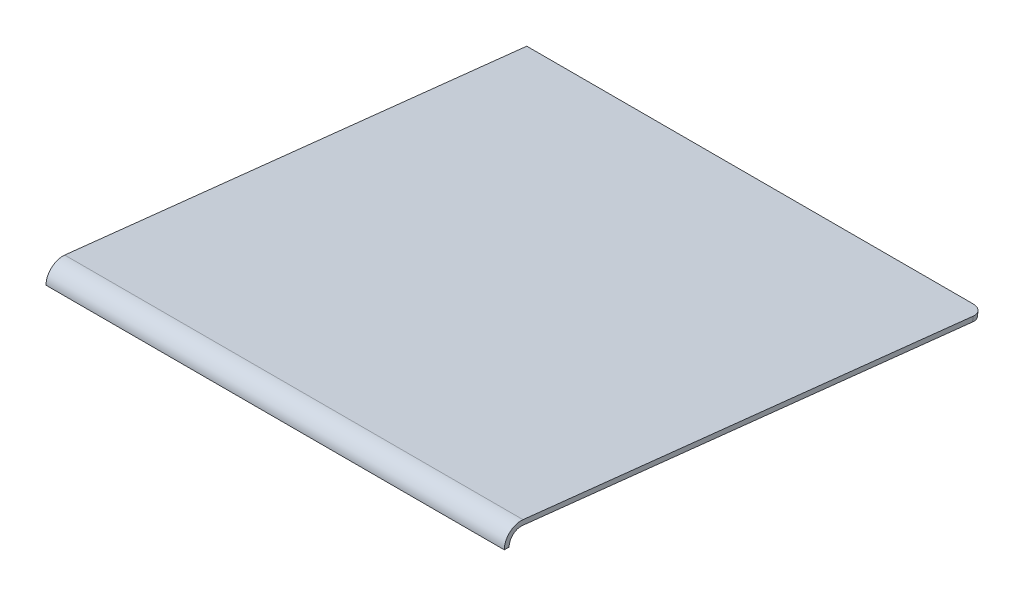
ISO-10303-21;
HEADER;
FILE_DESCRIPTION(('STEP AP214'),'2;1');
FILE_NAME('part.step','',(''),(''),'','','');
FILE_SCHEMA(('AUTOMOTIVE_DESIGN { 1 0 10303 214 1 1 1 1 }'));
ENDSEC;
DATA;
#1=APPLICATION_CONTEXT('core data for automotive mechanical design processes');
#2=APPLICATION_PROTOCOL_DEFINITION('international standard','automotive_design',2000,#1);
#3=PRODUCT_CONTEXT('',#1,'mechanical');
#4=PRODUCT('Part','Part','',(#3));
#5=PRODUCT_RELATED_PRODUCT_CATEGORY('part','',(#4));
#6=PRODUCT_DEFINITION_FORMATION('','',#4);
#7=PRODUCT_DEFINITION_CONTEXT('part definition',#1,'design');
#8=PRODUCT_DEFINITION('design','',#6,#7);
#9=PRODUCT_DEFINITION_SHAPE('','',#8);
#10=(LENGTH_UNIT() NAMED_UNIT(*) SI_UNIT(.MILLI.,.METRE.));
#11=(NAMED_UNIT(*) PLANE_ANGLE_UNIT() SI_UNIT($,.RADIAN.));
#12=(NAMED_UNIT(*) SI_UNIT($,.STERADIAN.) SOLID_ANGLE_UNIT());
#13=UNCERTAINTY_MEASURE_WITH_UNIT(LENGTH_MEASURE(1.E-05),#10,'distance_accuracy_value','');
#14=(GEOMETRIC_REPRESENTATION_CONTEXT(3) GLOBAL_UNCERTAINTY_ASSIGNED_CONTEXT((#13)) GLOBAL_UNIT_ASSIGNED_CONTEXT((#10,
#11,#12)) REPRESENTATION_CONTEXT('',''));
#15=CARTESIAN_POINT('',(0.,0.,0.));
#16=DIRECTION('',(0.,0.,1.));
#17=DIRECTION('',(1.,0.,0.));
#18=AXIS2_PLACEMENT_3D('',#15,#16,#17);
#19=CARTESIAN_POINT('',(362.,0.,0.));
#20=DIRECTION('',(1.,0.,0.));
#21=DIRECTION('',(0.,0.,-1.));
#22=AXIS2_PLACEMENT_3D('',#19,#20,#21);
#23=PLANE('',#22);
#24=DIRECTION('',(0.,0.,-1.));
#25=VECTOR('',#24,1.);
#26=CARTESIAN_POINT('',(362.,113.937005826671,37.4));
#27=LINE('',#26,#25);
#28=CARTESIAN_POINT('',(362.,113.937005826671,39.4));
#29=VERTEX_POINT('',#28);
#30=CARTESIAN_POINT('',(362.,113.937005826671,37.4));
#31=VERTEX_POINT('',#30);
#32=EDGE_CURVE('E207',#29,#31,#27,.T.);
#33=ORIENTED_EDGE('',*,*,#32,.T.);
#34=CARTESIAN_POINT('',(362.,113.937005826671,32.4));
#35=DIRECTION('',(1.,0.,0.));
#36=DIRECTION('',(0.,0.,-1.));
#37=AXIS2_PLACEMENT_3D('',#34,#35,#36);
#38=CIRCLE('',#37,5.00000000000001);
#39=CARTESIAN_POINT('',(362.,118.907830843486,31.8606497870554));
#40=VERTEX_POINT('',#39);
#41=EDGE_CURVE('E203',#40,#31,#38,.T.);
#42=ORIENTED_EDGE('',*,*,#41,.F.);
#43=DIRECTION('',(0.,0.107870042588919,0.994165003363056));
#44=VECTOR('',#43,1.);
#45=CARTESIAN_POINT('',(362.,100.,-142.4));
#46=LINE('',#45,#44);
#47=CARTESIAN_POINT('',(362.,98.6622549779722,-154.729088340045));
#48=VERTEX_POINT('',#47);
#49=EDGE_CURVE('E164',#48,#40,#46,.T.);
#50=ORIENTED_EDGE('',*,*,#49,.F.);
#51=DIRECTION('',(0.,-0.994165003363056,0.107870042588914));
#52=VECTOR('',#51,1.);
#53=CARTESIAN_POINT('',(362.,-15.4452148796673,-142.348067491777));
#54=LINE('',#53,#52);
#55=CARTESIAN_POINT('',(362.,100.650584984698,-154.944828425223));
#56=VERTEX_POINT('',#55);
#57=EDGE_CURVE('E159',#48,#56,#54,.F.);
#58=ORIENTED_EDGE('',*,*,#57,.T.);
#59=DIRECTION('',(0.,-0.107870042588919,-0.994165003363056));
#60=VECTOR('',#59,1.);
#61=CARTESIAN_POINT('',(362.,101.988330006726,-142.615740085178));
#62=LINE('',#61,#60);
#63=CARTESIAN_POINT('',(362.,120.896160850212,31.6449097018776));
#64=VERTEX_POINT('',#63);
#65=EDGE_CURVE('E189',#64,#56,#62,.T.);
#66=ORIENTED_EDGE('',*,*,#65,.F.);
#67=CARTESIAN_POINT('',(362.,113.937005826671,32.4));
#68=DIRECTION('',(1.,0.,0.));
#69=DIRECTION('',(0.,0.,-1.));
#70=AXIS2_PLACEMENT_3D('',#67,#68,#69);
#71=CIRCLE('',#70,7.00000000000001);
#72=EDGE_CURVE('E190',#29,#64,#71,.F.);
#73=ORIENTED_EDGE('',*,*,#72,.F.);
#74=EDGE_LOOP('',(#33,#42,#50,#58,#66,#73));
#75=FACE_BOUND('',#74,.T.);
#76=ADVANCED_FACE('F91',(#75),#23,.T.);
#77=CARTESIAN_POINT('',(853.368633251326,113.937005826671,32.4));
#78=DIRECTION('',(-1.,0.,0.));
#79=DIRECTION('',(0.,0.,1.));
#80=AXIS2_PLACEMENT_3D('',#77,#78,#79);
#81=CYLINDRICAL_SURFACE('',#80,5.00000000000001);
#82=CARTESIAN_POINT('',(172.,113.937005826671,32.4));
#83=DIRECTION('',(1.,0.,0.));
#84=DIRECTION('',(0.,0.,-1.));
#85=AXIS2_PLACEMENT_3D('',#82,#83,#84);
#86=CIRCLE('',#85,5.00000000000001);
#87=CARTESIAN_POINT('',(172.,118.907830843486,31.8606497870554));
#88=VERTEX_POINT('',#87);
#89=CARTESIAN_POINT('',(172.,113.937005826671,37.4));
#90=VERTEX_POINT('',#89);
#91=EDGE_CURVE('E126',#88,#90,#86,.T.);
#92=ORIENTED_EDGE('',*,*,#91,.F.);
#93=DIRECTION('',(-1.,0.,0.));
#94=VECTOR('',#93,1.);
#95=CARTESIAN_POINT('',(853.368633251326,118.907830843486,31.8606497870554));
#96=LINE('',#95,#94);
#97=EDGE_CURVE('E182',#40,#88,#96,.T.);
#98=ORIENTED_EDGE('',*,*,#97,.F.);
#99=ORIENTED_EDGE('',*,*,#41,.T.);
#100=DIRECTION('',(-1.,0.,0.));
#101=VECTOR('',#100,1.);
#102=CARTESIAN_POINT('',(853.368633251326,113.937005826671,37.4));
#103=LINE('',#102,#101);
#104=EDGE_CURVE('E95',#31,#90,#103,.T.);
#105=ORIENTED_EDGE('',*,*,#104,.T.);
#106=EDGE_LOOP('',(#92,#98,#99,#105));
#107=FACE_BOUND('',#106,.T.);
#108=ADVANCED_FACE('F93',(#107),#81,.F.);
#109=CARTESIAN_POINT('',(853.368633251326,113.937005826671,32.4));
#110=DIRECTION('',(-1.,0.,0.));
#111=DIRECTION('',(0.,0.,1.));
#112=AXIS2_PLACEMENT_3D('',#109,#110,#111);
#113=CYLINDRICAL_SURFACE('',#112,7.00000000000001);
#114=CARTESIAN_POINT('',(172.,113.937005826671,32.4));
#115=DIRECTION('',(1.,0.,0.));
#116=DIRECTION('',(0.,0.,-1.));
#117=AXIS2_PLACEMENT_3D('',#114,#115,#116);
#118=CIRCLE('',#117,7.00000000000001);
#119=CARTESIAN_POINT('',(172.,113.937005826671,39.4));
#120=VERTEX_POINT('',#119);
#121=CARTESIAN_POINT('',(172.,120.896160850212,31.6449097018776));
#122=VERTEX_POINT('',#121);
#123=EDGE_CURVE('E102',#120,#122,#118,.F.);
#124=ORIENTED_EDGE('',*,*,#123,.F.);
#125=DIRECTION('',(-1.,0.,0.));
#126=VECTOR('',#125,1.);
#127=CARTESIAN_POINT('',(853.368633251326,113.937005826671,39.4));
#128=LINE('',#127,#126);
#129=EDGE_CURVE('E218',#29,#120,#128,.T.);
#130=ORIENTED_EDGE('',*,*,#129,.F.);
#131=ORIENTED_EDGE('',*,*,#72,.T.);
#132=DIRECTION('',(-1.,0.,0.));
#133=VECTOR('',#132,1.);
#134=CARTESIAN_POINT('',(853.368633251326,120.896160850212,31.6449097018776));
#135=LINE('',#134,#133);
#136=EDGE_CURVE('E186',#64,#122,#135,.T.);
#137=ORIENTED_EDGE('',*,*,#136,.T.);
#138=EDGE_LOOP('',(#124,#130,#131,#137));
#139=FACE_BOUND('',#138,.T.);
#140=ADVANCED_FACE('F252',(#139),#113,.T.);
#141=CARTESIAN_POINT('',(853.368633251326,101.988330006726,-142.615740085178));
#142=DIRECTION('',(0.,0.994165003363056,-0.107870042588919));
#143=DIRECTION('',(0.,0.107870042588919,0.994165003363056));
#144=AXIS2_PLACEMENT_3D('',#141,#142,#143);
#145=PLANE('',#144);
#146=DIRECTION('',(0.,-0.107870042588919,-0.994165003363056));
#147=VECTOR('',#146,1.);
#148=CARTESIAN_POINT('',(172.,116.095799864366,-12.5967609334469));
#149=LINE('',#148,#147);
#150=CARTESIAN_POINT('',(172.,100.111234771754,-159.915653442038));
#151=VERTEX_POINT('',#150);
#152=EDGE_CURVE('E12',#122,#151,#149,.T.);
#153=ORIENTED_EDGE('',*,*,#152,.F.);
#154=ORIENTED_EDGE('',*,*,#136,.F.);
#155=ORIENTED_EDGE('',*,*,#65,.T.);
#156=CARTESIAN_POINT('',(357.,100.650584984698,-154.944828425223));
#157=DIRECTION('',(0.,0.994165003363056,-0.107870042588919));
#158=DIRECTION('',(0.,0.107870042588919,0.994165003363056));
#159=AXIS2_PLACEMENT_3D('',#156,#157,#158);
#160=CIRCLE('',#159,5.);
#161=CARTESIAN_POINT('',(357.,100.111234771754,-159.915653442038));
#162=VERTEX_POINT('',#161);
#163=EDGE_CURVE('E185',#56,#162,#160,.T.);
#164=ORIENTED_EDGE('',*,*,#163,.T.);
#165=DIRECTION('',(-1.,0.,0.));
#166=VECTOR('',#165,1.);
#167=CARTESIAN_POINT('',(853.368633251326,100.111234771754,-159.915653442038));
#168=LINE('',#167,#166);
#169=EDGE_CURVE('E172',#162,#151,#168,.T.);
#170=ORIENTED_EDGE('',*,*,#169,.T.);
#171=EDGE_LOOP('',(#153,#154,#155,#164,#170));
#172=FACE_BOUND('',#171,.T.);
#173=ADVANCED_FACE('F257',(#172),#145,.T.);
#174=CARTESIAN_POINT('',(853.368633251326,100.111234771754,-159.915653442038));
#175=DIRECTION('',(0.,-0.107870042588914,-0.994165003363056));
#176=DIRECTION('',(0.,0.994165003363056,-0.107870042588914));
#177=AXIS2_PLACEMENT_3D('',#174,#175,#176);
#178=PLANE('',#177);
#179=DIRECTION('',(0.,0.994165003363056,-0.107870042588919));
#180=VECTOR('',#179,1.);
#181=CARTESIAN_POINT('',(172.,76.7713063651824,-157.383197498887));
#182=LINE('',#181,#180);
#183=CARTESIAN_POINT('',(172.,98.1229047650276,-159.69991335686));
#184=VERTEX_POINT('',#183);
#185=EDGE_CURVE('E109',#184,#151,#182,.T.);
#186=ORIENTED_EDGE('',*,*,#185,.T.);
#187=ORIENTED_EDGE('',*,*,#169,.F.);
#188=DIRECTION('',(0.,-0.994165003363056,0.107870042588914));
#189=VECTOR('',#188,1.);
#190=CARTESIAN_POINT('',(357.,100.111234771754,-159.915653442038));
#191=LINE('',#190,#189);
#192=CARTESIAN_POINT('',(357.,98.1229047650276,-159.69991335686));
#193=VERTEX_POINT('',#192);
#194=EDGE_CURVE('E158',#162,#193,#191,.T.);
#195=ORIENTED_EDGE('',*,*,#194,.T.);
#196=DIRECTION('',(-1.,0.,0.));
#197=VECTOR('',#196,1.);
#198=CARTESIAN_POINT('',(853.368633251326,98.1229047650276,-159.69991335686));
#199=LINE('',#198,#197);
#200=EDGE_CURVE('E165',#193,#184,#199,.T.);
#201=ORIENTED_EDGE('',*,*,#200,.T.);
#202=EDGE_LOOP('',(#186,#187,#195,#201));
#203=FACE_BOUND('',#202,.T.);
#204=ADVANCED_FACE('F170',(#203),#178,.T.);
#205=CARTESIAN_POINT('',(853.368633251326,100.,-142.4));
#206=DIRECTION('',(0.,-0.994165003363056,0.107870042588919));
#207=DIRECTION('',(0.,-0.107870042588919,-0.994165003363056));
#208=AXIS2_PLACEMENT_3D('',#205,#206,#207);
#209=PLANE('',#208);
#210=DIRECTION('',(0.,0.107870042588919,0.994165003363056));
#211=VECTOR('',#210,1.);
#212=CARTESIAN_POINT('',(172.,100.,-142.4));
#213=LINE('',#212,#211);
#214=EDGE_CURVE('E177',#184,#88,#213,.T.);
#215=ORIENTED_EDGE('',*,*,#214,.F.);
#216=ORIENTED_EDGE('',*,*,#200,.F.);
#217=CARTESIAN_POINT('',(357.,98.6622549779722,-154.729088340045));
#218=DIRECTION('',(0.,-0.994165003363056,0.107870042588919));
#219=DIRECTION('',(0.,-0.107870042588919,-0.994165003363056));
#220=AXIS2_PLACEMENT_3D('',#217,#218,#219);
#221=CIRCLE('',#220,5.);
#222=EDGE_CURVE('E154',#193,#48,#221,.T.);
#223=ORIENTED_EDGE('',*,*,#222,.T.);
#224=ORIENTED_EDGE('',*,*,#49,.T.);
#225=ORIENTED_EDGE('',*,*,#97,.T.);
#226=EDGE_LOOP('',(#215,#216,#223,#224,#225));
#227=FACE_BOUND('',#226,.T.);
#228=ADVANCED_FACE('F175',(#227),#209,.T.);
#229=CARTESIAN_POINT('',(357.,100.650584984698,-154.944828425223));
#230=DIRECTION('',(0.,-0.994165003363056,0.107870042588914));
#231=DIRECTION('',(0.,-0.107870042588914,-0.994165003363056));
#232=AXIS2_PLACEMENT_3D('',#229,#230,#231);
#233=CYLINDRICAL_SURFACE('',#232,5.);
#234=ORIENTED_EDGE('',*,*,#163,.F.);
#235=ORIENTED_EDGE('',*,*,#57,.F.);
#236=ORIENTED_EDGE('',*,*,#222,.F.);
#237=ORIENTED_EDGE('',*,*,#194,.F.);
#238=EDGE_LOOP('',(#234,#235,#236,#237));
#239=FACE_BOUND('',#238,.T.);
#240=ADVANCED_FACE('F157',(#239),#233,.T.);
#241=CARTESIAN_POINT('',(364.061552812809,113.937005826671,37.4));
#242=DIRECTION('',(0.,1.,0.));
#243=DIRECTION('',(0.,0.,1.));
#244=AXIS2_PLACEMENT_3D('',#241,#242,#243);
#245=PLANE('',#244);
#246=ORIENTED_EDGE('',*,*,#129,.T.);
#247=DIRECTION('',(0.,0.,-1.));
#248=VECTOR('',#247,1.);
#249=CARTESIAN_POINT('',(172.,113.937005826671,37.4));
#250=LINE('',#249,#248);
#251=EDGE_CURVE('E122',#120,#90,#250,.T.);
#252=ORIENTED_EDGE('',*,*,#251,.T.);
#253=ORIENTED_EDGE('',*,*,#104,.F.);
#254=ORIENTED_EDGE('',*,*,#32,.F.);
#255=EDGE_LOOP('',(#246,#252,#253,#254));
#256=FACE_BOUND('',#255,.T.);
#257=ADVANCED_FACE('F236',(#256),#245,.F.);
#258=CARTESIAN_POINT('',(172.,92.755871457795,-10.0643049902962));
#259=DIRECTION('',(1.,0.,0.));
#260=DIRECTION('',(0.,0.,-1.));
#261=AXIS2_PLACEMENT_3D('',#258,#259,#260);
#262=PLANE('',#261);
#263=ORIENTED_EDGE('',*,*,#214,.T.);
#264=ORIENTED_EDGE('',*,*,#91,.T.);
#265=ORIENTED_EDGE('',*,*,#251,.F.);
#266=ORIENTED_EDGE('',*,*,#123,.T.);
#267=ORIENTED_EDGE('',*,*,#152,.T.);
#268=ORIENTED_EDGE('',*,*,#185,.F.);
#269=EDGE_LOOP('',(#263,#264,#265,#266,#267,#268));
#270=FACE_BOUND('',#269,.T.);
#271=ADVANCED_FACE('F238',(#270),#262,.F.);
#272=CLOSED_SHELL('',(#76,#108,#140,#173,#204,#228,#240,#257,#271));
#273=MANIFOLD_SOLID_BREP('B2',#272);
#274=ADVANCED_BREP_SHAPE_REPRESENTATION('',(#18,#273),#14);
#275=SHAPE_DEFINITION_REPRESENTATION(#9,#274);
ENDSEC;
END-ISO-10303-21;
